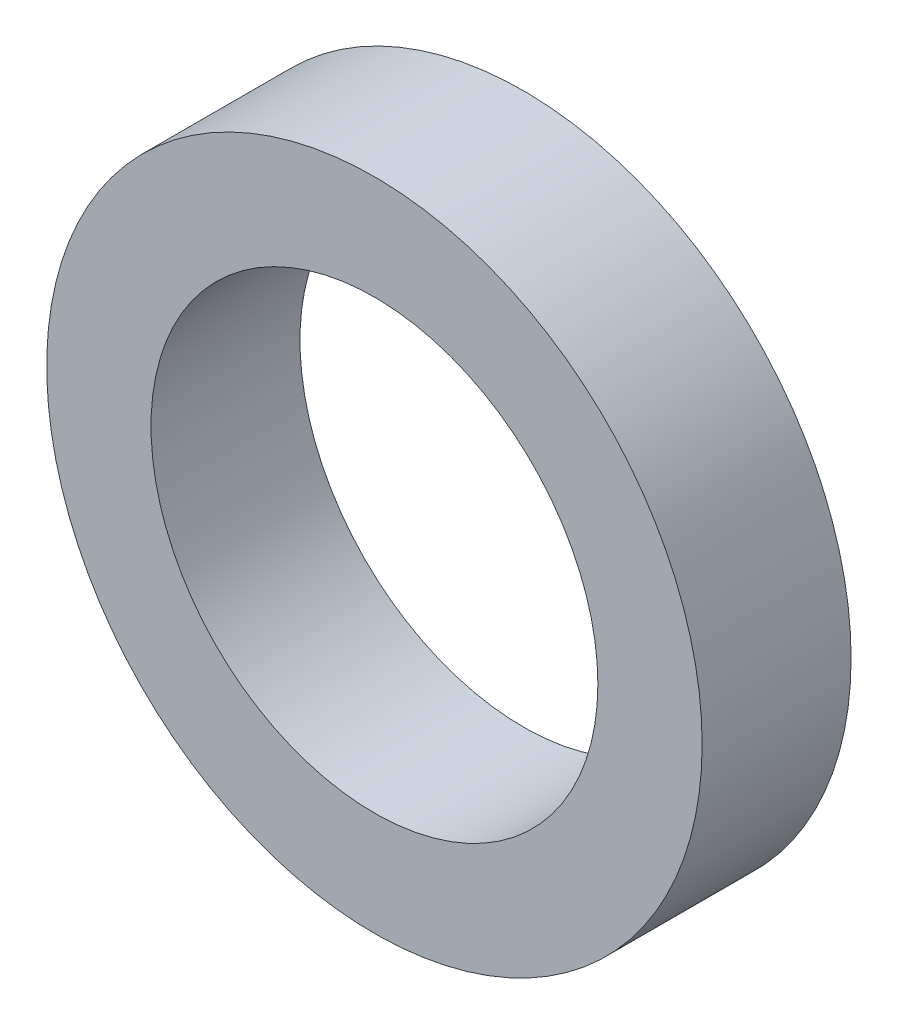
ISO-10303-21;
HEADER;
FILE_DESCRIPTION(('STEP AP214'),'2;1');
FILE_NAME('part.step','',(''),(''),'','','');
FILE_SCHEMA(('AUTOMOTIVE_DESIGN { 1 0 10303 214 1 1 1 1 }'));
ENDSEC;
DATA;
#1=APPLICATION_CONTEXT('core data for automotive mechanical design processes');
#2=APPLICATION_PROTOCOL_DEFINITION('international standard','automotive_design',2000,#1);
#3=PRODUCT_CONTEXT('',#1,'mechanical');
#4=PRODUCT('Part','Part','',(#3));
#5=PRODUCT_RELATED_PRODUCT_CATEGORY('part','',(#4));
#6=PRODUCT_DEFINITION_FORMATION('','',#4);
#7=PRODUCT_DEFINITION_CONTEXT('part definition',#1,'design');
#8=PRODUCT_DEFINITION('design','',#6,#7);
#9=PRODUCT_DEFINITION_SHAPE('','',#8);
#10=(LENGTH_UNIT() NAMED_UNIT(*) SI_UNIT(.MILLI.,.METRE.));
#11=(NAMED_UNIT(*) PLANE_ANGLE_UNIT() SI_UNIT($,.RADIAN.));
#12=(NAMED_UNIT(*) SI_UNIT($,.STERADIAN.) SOLID_ANGLE_UNIT());
#13=UNCERTAINTY_MEASURE_WITH_UNIT(LENGTH_MEASURE(1.E-05),#10,'distance_accuracy_value','');
#14=(GEOMETRIC_REPRESENTATION_CONTEXT(3) GLOBAL_UNCERTAINTY_ASSIGNED_CONTEXT((#13)) GLOBAL_UNIT_ASSIGNED_CONTEXT((#10,
#11,#12)) REPRESENTATION_CONTEXT('',''));
#15=CARTESIAN_POINT('',(0.,0.,0.));
#16=DIRECTION('',(0.,0.,1.));
#17=DIRECTION('',(1.,0.,0.));
#18=AXIS2_PLACEMENT_3D('',#15,#16,#17);
#19=CARTESIAN_POINT('',(0.,0.,10.));
#20=DIRECTION('',(0.,0.,1.));
#21=DIRECTION('',(1.,0.,0.));
#22=AXIS2_PLACEMENT_3D('',#19,#20,#21);
#23=PLANE('',#22);
#24=CARTESIAN_POINT('',(0.,0.,10.));
#25=DIRECTION('',(0.,0.,1.));
#26=DIRECTION('',(1.,0.,0.));
#27=AXIS2_PLACEMENT_3D('',#24,#25,#26);
#28=CIRCLE('',#27,22.);
#29=CARTESIAN_POINT('',(22.,0.,10.));
#30=VERTEX_POINT('',#29);
#31=EDGE_CURVE('E10',#30,#30,#28,.T.);
#32=ORIENTED_EDGE('',*,*,#31,.T.);
#33=EDGE_LOOP('',(#32));
#34=FACE_BOUND('',#33,.T.);
#35=CARTESIAN_POINT('',(0.,0.,10.));
#36=DIRECTION('',(0.,0.,1.));
#37=DIRECTION('',(1.,0.,0.));
#38=AXIS2_PLACEMENT_3D('',#35,#36,#37);
#39=CIRCLE('',#38,15.);
#40=CARTESIAN_POINT('',(15.,0.,10.));
#41=VERTEX_POINT('',#40);
#42=EDGE_CURVE('E48',#41,#41,#39,.T.);
#43=ORIENTED_EDGE('',*,*,#42,.F.);
#44=EDGE_LOOP('',(#43));
#45=FACE_BOUND('',#44,.T.);
#46=ADVANCED_FACE('F37',(#34,#45),#23,.T.);
#47=CARTESIAN_POINT('',(0.,0.,0.));
#48=DIRECTION('',(0.,0.,1.));
#49=DIRECTION('',(1.,0.,0.));
#50=AXIS2_PLACEMENT_3D('',#47,#48,#49);
#51=PLANE('',#50);
#52=CARTESIAN_POINT('',(0.,0.,0.));
#53=DIRECTION('',(0.,0.,1.));
#54=DIRECTION('',(1.,0.,0.));
#55=AXIS2_PLACEMENT_3D('',#52,#53,#54);
#56=CIRCLE('',#55,22.);
#57=CARTESIAN_POINT('',(22.,0.,0.));
#58=VERTEX_POINT('',#57);
#59=EDGE_CURVE('E41',#58,#58,#56,.T.);
#60=ORIENTED_EDGE('',*,*,#59,.F.);
#61=EDGE_LOOP('',(#60));
#62=FACE_BOUND('',#61,.T.);
#63=CARTESIAN_POINT('',(0.,0.,0.));
#64=DIRECTION('',(0.,0.,1.));
#65=DIRECTION('',(1.,0.,0.));
#66=AXIS2_PLACEMENT_3D('',#63,#64,#65);
#67=CIRCLE('',#66,15.);
#68=CARTESIAN_POINT('',(15.,0.,0.));
#69=VERTEX_POINT('',#68);
#70=EDGE_CURVE('E50',#69,#69,#67,.T.);
#71=ORIENTED_EDGE('',*,*,#70,.T.);
#72=EDGE_LOOP('',(#71));
#73=FACE_BOUND('',#72,.T.);
#74=ADVANCED_FACE('F60',(#62,#73),#51,.F.);
#75=CARTESIAN_POINT('',(0.,0.,10.));
#76=DIRECTION('',(0.,0.,-1.));
#77=DIRECTION('',(-1.,0.,0.));
#78=AXIS2_PLACEMENT_3D('',#75,#76,#77);
#79=CYLINDRICAL_SURFACE('',#78,22.);
#80=ORIENTED_EDGE('',*,*,#31,.F.);
#81=EDGE_LOOP('',(#80));
#82=FACE_BOUND('',#81,.T.);
#83=ORIENTED_EDGE('',*,*,#59,.T.);
#84=EDGE_LOOP('',(#83));
#85=FACE_BOUND('',#84,.T.);
#86=ADVANCED_FACE('F39',(#82,#85),#79,.T.);
#87=CARTESIAN_POINT('',(0.,0.,10.));
#88=DIRECTION('',(0.,0.,-1.));
#89=DIRECTION('',(-1.,0.,0.));
#90=AXIS2_PLACEMENT_3D('',#87,#88,#89);
#91=CYLINDRICAL_SURFACE('',#90,15.);
#92=ORIENTED_EDGE('',*,*,#42,.T.);
#93=EDGE_LOOP('',(#92));
#94=FACE_BOUND('',#93,.T.);
#95=ORIENTED_EDGE('',*,*,#70,.F.);
#96=EDGE_LOOP('',(#95));
#97=FACE_BOUND('',#96,.T.);
#98=ADVANCED_FACE('F56',(#94,#97),#91,.F.);
#99=CLOSED_SHELL('',(#46,#74,#86,#98));
#100=MANIFOLD_SOLID_BREP('B2',#99);
#101=ADVANCED_BREP_SHAPE_REPRESENTATION('',(#18,#100),#14);
#102=SHAPE_DEFINITION_REPRESENTATION(#9,#101);
ENDSEC;
END-ISO-10303-21;
